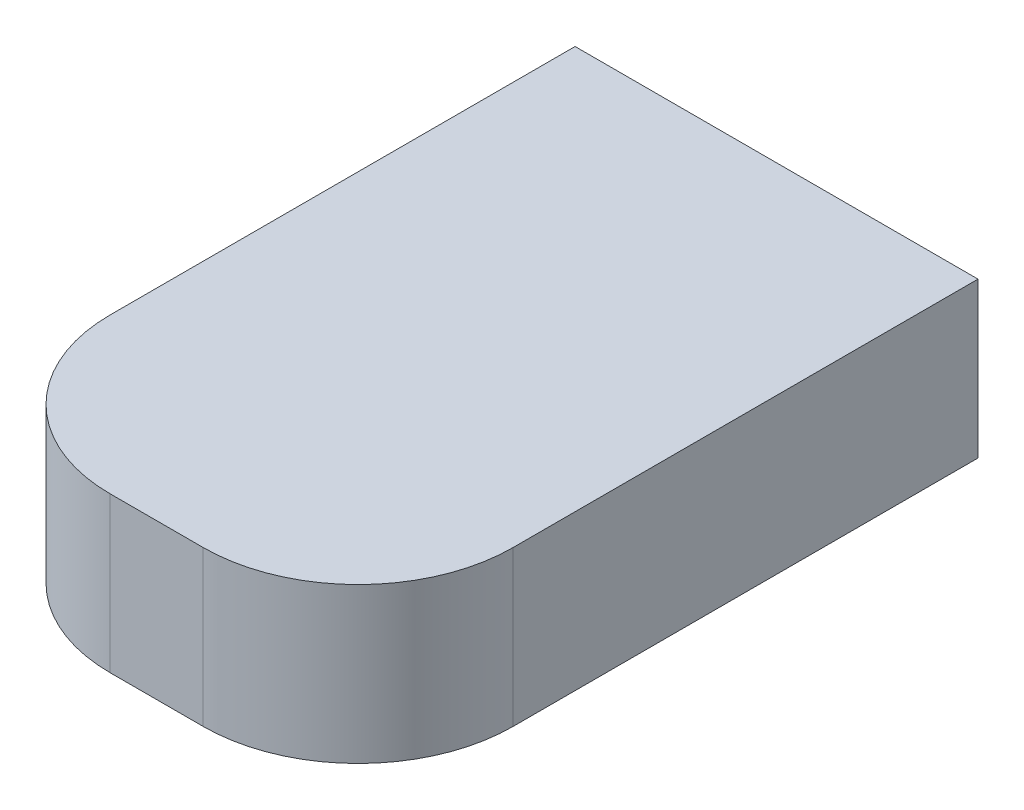
ISO-10303-21;
HEADER;
FILE_DESCRIPTION(('STEP AP214'),'2;1');
FILE_NAME('part.step','',(''),(''),'','','');
FILE_SCHEMA(('AUTOMOTIVE_DESIGN { 1 0 10303 214 1 1 1 1 }'));
ENDSEC;
DATA;
#1=APPLICATION_CONTEXT('core data for automotive mechanical design processes');
#2=APPLICATION_PROTOCOL_DEFINITION('international standard','automotive_design',2000,#1);
#3=PRODUCT_CONTEXT('',#1,'mechanical');
#4=PRODUCT('Part','Part','',(#3));
#5=PRODUCT_RELATED_PRODUCT_CATEGORY('part','',(#4));
#6=PRODUCT_DEFINITION_FORMATION('','',#4);
#7=PRODUCT_DEFINITION_CONTEXT('part definition',#1,'design');
#8=PRODUCT_DEFINITION('design','',#6,#7);
#9=PRODUCT_DEFINITION_SHAPE('','',#8);
#10=(LENGTH_UNIT() NAMED_UNIT(*) SI_UNIT(.MILLI.,.METRE.));
#11=(NAMED_UNIT(*) PLANE_ANGLE_UNIT() SI_UNIT($,.RADIAN.));
#12=(NAMED_UNIT(*) SI_UNIT($,.STERADIAN.) SOLID_ANGLE_UNIT());
#13=UNCERTAINTY_MEASURE_WITH_UNIT(LENGTH_MEASURE(1.E-05),#10,'distance_accuracy_value','');
#14=(GEOMETRIC_REPRESENTATION_CONTEXT(3) GLOBAL_UNCERTAINTY_ASSIGNED_CONTEXT((#13)) GLOBAL_UNIT_ASSIGNED_CONTEXT((#10,
#11,#12)) REPRESENTATION_CONTEXT('',''));
#15=CARTESIAN_POINT('',(0.,0.,0.));
#16=DIRECTION('',(0.,0.,1.));
#17=DIRECTION('',(1.,0.,0.));
#18=AXIS2_PLACEMENT_3D('',#15,#16,#17);
#19=CARTESIAN_POINT('',(1.95,1.5,3.));
#20=DIRECTION('',(-1.,0.,0.));
#21=DIRECTION('',(0.,0.,1.));
#22=AXIS2_PLACEMENT_3D('',#19,#20,#21);
#23=PLANE('',#22);
#24=DIRECTION('',(0.,0.,-1.));
#25=VECTOR('',#24,1.);
#26=CARTESIAN_POINT('',(1.95,1.5,3.));
#27=LINE('',#26,#25);
#28=CARTESIAN_POINT('',(1.95,1.5,1.5));
#29=VERTEX_POINT('',#28);
#30=CARTESIAN_POINT('',(1.95,1.5,-3.));
#31=VERTEX_POINT('',#30);
#32=EDGE_CURVE('E86',#29,#31,#27,.T.);
#33=ORIENTED_EDGE('',*,*,#32,.F.);
#34=DIRECTION('',(0.,-1.,0.));
#35=VECTOR('',#34,1.);
#36=CARTESIAN_POINT('',(1.95,1.5,1.5));
#37=LINE('',#36,#35);
#38=CARTESIAN_POINT('',(1.95,0.,1.5));
#39=VERTEX_POINT('',#38);
#40=EDGE_CURVE('E109',#29,#39,#37,.T.);
#41=ORIENTED_EDGE('',*,*,#40,.T.);
#42=DIRECTION('',(0.,0.,-1.));
#43=VECTOR('',#42,1.);
#44=CARTESIAN_POINT('',(1.95,0.,3.));
#45=LINE('',#44,#43);
#46=CARTESIAN_POINT('',(1.95,0.,-3.));
#47=VERTEX_POINT('',#46);
#48=EDGE_CURVE('E107',#39,#47,#45,.T.);
#49=ORIENTED_EDGE('',*,*,#48,.T.);
#50=DIRECTION('',(0.,-1.,0.));
#51=VECTOR('',#50,1.);
#52=CARTESIAN_POINT('',(1.95,1.5,-3.));
#53=LINE('',#52,#51);
#54=EDGE_CURVE('E101',#31,#47,#53,.T.);
#55=ORIENTED_EDGE('',*,*,#54,.F.);
#56=EDGE_LOOP('',(#33,#41,#49,#55));
#57=FACE_BOUND('',#56,.T.);
#58=ADVANCED_FACE('F32',(#57),#23,.F.);
#59=CARTESIAN_POINT('',(-1.95,1.5,-3.));
#60=DIRECTION('',(0.,0.,1.));
#61=DIRECTION('',(1.,0.,0.));
#62=AXIS2_PLACEMENT_3D('',#59,#60,#61);
#63=PLANE('',#62);
#64=DIRECTION('',(-1.,0.,0.));
#65=VECTOR('',#64,1.);
#66=CARTESIAN_POINT('',(-1.95,0.,-3.));
#67=LINE('',#66,#65);
#68=CARTESIAN_POINT('',(-1.95,0.,-3.));
#69=VERTEX_POINT('',#68);
#70=EDGE_CURVE('E136',#47,#69,#67,.T.);
#71=ORIENTED_EDGE('',*,*,#70,.T.);
#72=DIRECTION('',(0.,-1.,0.));
#73=VECTOR('',#72,1.);
#74=CARTESIAN_POINT('',(-1.95,1.5,-3.));
#75=LINE('',#74,#73);
#76=CARTESIAN_POINT('',(-1.95,1.5,-3.));
#77=VERTEX_POINT('',#76);
#78=EDGE_CURVE('E103',#77,#69,#75,.T.);
#79=ORIENTED_EDGE('',*,*,#78,.F.);
#80=DIRECTION('',(-1.,0.,0.));
#81=VECTOR('',#80,1.);
#82=CARTESIAN_POINT('',(-1.95,1.5,-3.));
#83=LINE('',#82,#81);
#84=EDGE_CURVE('E89',#31,#77,#83,.T.);
#85=ORIENTED_EDGE('',*,*,#84,.F.);
#86=ORIENTED_EDGE('',*,*,#54,.T.);
#87=EDGE_LOOP('',(#71,#79,#85,#86));
#88=FACE_BOUND('',#87,.T.);
#89=ADVANCED_FACE('F100',(#88),#63,.F.);
#90=CARTESIAN_POINT('',(-1.95,1.5,3.));
#91=DIRECTION('',(1.,0.,0.));
#92=DIRECTION('',(0.,0.,-1.));
#93=AXIS2_PLACEMENT_3D('',#90,#91,#92);
#94=PLANE('',#93);
#95=DIRECTION('',(0.,0.,1.));
#96=VECTOR('',#95,1.);
#97=CARTESIAN_POINT('',(-1.95,0.,3.));
#98=LINE('',#97,#96);
#99=CARTESIAN_POINT('',(-1.95,0.,1.5));
#100=VERTEX_POINT('',#99);
#101=EDGE_CURVE('E134',#69,#100,#98,.T.);
#102=ORIENTED_EDGE('',*,*,#101,.T.);
#103=DIRECTION('',(0.,-1.,0.));
#104=VECTOR('',#103,1.);
#105=CARTESIAN_POINT('',(-1.95,1.5,1.5));
#106=LINE('',#105,#104);
#107=CARTESIAN_POINT('',(-1.95,1.5,1.5));
#108=VERTEX_POINT('',#107);
#109=EDGE_CURVE('E11',#100,#108,#106,.F.);
#110=ORIENTED_EDGE('',*,*,#109,.T.);
#111=DIRECTION('',(0.,0.,1.));
#112=VECTOR('',#111,1.);
#113=CARTESIAN_POINT('',(-1.95,1.5,3.));
#114=LINE('',#113,#112);
#115=EDGE_CURVE('E104',#77,#108,#114,.T.);
#116=ORIENTED_EDGE('',*,*,#115,.F.);
#117=ORIENTED_EDGE('',*,*,#78,.T.);
#118=EDGE_LOOP('',(#102,#110,#116,#117));
#119=FACE_BOUND('',#118,.T.);
#120=ADVANCED_FACE('F135',(#119),#94,.F.);
#121=CARTESIAN_POINT('',(-1.95,1.5,3.));
#122=DIRECTION('',(0.,0.,-1.));
#123=DIRECTION('',(-1.,0.,0.));
#124=AXIS2_PLACEMENT_3D('',#121,#122,#123);
#125=PLANE('',#124);
#126=DIRECTION('',(1.,0.,0.));
#127=VECTOR('',#126,1.);
#128=CARTESIAN_POINT('',(-1.95,0.,3.));
#129=LINE('',#128,#127);
#130=CARTESIAN_POINT('',(-0.45,0.,3.));
#131=VERTEX_POINT('',#130);
#132=CARTESIAN_POINT('',(0.45,0.,3.));
#133=VERTEX_POINT('',#132);
#134=EDGE_CURVE('E96',#131,#133,#129,.T.);
#135=ORIENTED_EDGE('',*,*,#134,.T.);
#136=DIRECTION('',(0.,-1.,0.));
#137=VECTOR('',#136,1.);
#138=CARTESIAN_POINT('',(0.45,1.5,3.));
#139=LINE('',#138,#137);
#140=CARTESIAN_POINT('',(0.45,1.5,3.));
#141=VERTEX_POINT('',#140);
#142=EDGE_CURVE('E53',#133,#141,#139,.F.);
#143=ORIENTED_EDGE('',*,*,#142,.T.);
#144=DIRECTION('',(1.,0.,0.));
#145=VECTOR('',#144,1.);
#146=CARTESIAN_POINT('',(-1.95,1.5,3.));
#147=LINE('',#146,#145);
#148=CARTESIAN_POINT('',(-0.45,1.5,3.));
#149=VERTEX_POINT('',#148);
#150=EDGE_CURVE('E113',#149,#141,#147,.T.);
#151=ORIENTED_EDGE('',*,*,#150,.F.);
#152=DIRECTION('',(0.,-1.,0.));
#153=VECTOR('',#152,1.);
#154=CARTESIAN_POINT('',(-0.45,1.5,3.));
#155=LINE('',#154,#153);
#156=EDGE_CURVE('E120',#149,#131,#155,.T.);
#157=ORIENTED_EDGE('',*,*,#156,.T.);
#158=EDGE_LOOP('',(#135,#143,#151,#157));
#159=FACE_BOUND('',#158,.T.);
#160=ADVANCED_FACE('F128',(#159),#125,.F.);
#161=CARTESIAN_POINT('',(0.,1.5,0.));
#162=DIRECTION('',(0.,-1.,0.));
#163=DIRECTION('',(0.,0.,-1.));
#164=AXIS2_PLACEMENT_3D('',#161,#162,#163);
#165=PLANE('',#164);
#166=ORIENTED_EDGE('',*,*,#150,.T.);
#167=CARTESIAN_POINT('',(0.45,1.5,1.5));
#168=DIRECTION('',(0.,-1.,0.));
#169=DIRECTION('',(0.,0.,-1.));
#170=AXIS2_PLACEMENT_3D('',#167,#168,#169);
#171=CIRCLE('',#170,1.5);
#172=EDGE_CURVE('E40',#141,#29,#171,.F.);
#173=ORIENTED_EDGE('',*,*,#172,.T.);
#174=ORIENTED_EDGE('',*,*,#32,.T.);
#175=ORIENTED_EDGE('',*,*,#84,.T.);
#176=ORIENTED_EDGE('',*,*,#115,.T.);
#177=CARTESIAN_POINT('',(-0.45,1.5,1.5));
#178=DIRECTION('',(0.,-1.,0.));
#179=DIRECTION('',(0.,0.,-1.));
#180=AXIS2_PLACEMENT_3D('',#177,#178,#179);
#181=CIRCLE('',#180,1.5);
#182=EDGE_CURVE('E124',#108,#149,#181,.F.);
#183=ORIENTED_EDGE('',*,*,#182,.T.);
#184=EDGE_LOOP('',(#166,#173,#174,#175,#176,#183));
#185=FACE_BOUND('',#184,.T.);
#186=ADVANCED_FACE('F88',(#185),#165,.F.);
#187=CARTESIAN_POINT('',(0.,0.,0.));
#188=DIRECTION('',(0.,-1.,0.));
#189=DIRECTION('',(0.,0.,-1.));
#190=AXIS2_PLACEMENT_3D('',#187,#188,#189);
#191=PLANE('',#190);
#192=ORIENTED_EDGE('',*,*,#48,.F.);
#193=CARTESIAN_POINT('',(0.45,0.,1.5));
#194=DIRECTION('',(0.,-1.,0.));
#195=DIRECTION('',(0.,0.,-1.));
#196=AXIS2_PLACEMENT_3D('',#193,#194,#195);
#197=CIRCLE('',#196,1.5);
#198=EDGE_CURVE('E118',#39,#133,#197,.T.);
#199=ORIENTED_EDGE('',*,*,#198,.T.);
#200=ORIENTED_EDGE('',*,*,#134,.F.);
#201=CARTESIAN_POINT('',(-0.45,0.,1.5));
#202=DIRECTION('',(0.,-1.,0.));
#203=DIRECTION('',(0.,0.,-1.));
#204=AXIS2_PLACEMENT_3D('',#201,#202,#203);
#205=CIRCLE('',#204,1.5);
#206=EDGE_CURVE('E111',#131,#100,#205,.T.);
#207=ORIENTED_EDGE('',*,*,#206,.T.);
#208=ORIENTED_EDGE('',*,*,#101,.F.);
#209=ORIENTED_EDGE('',*,*,#70,.F.);
#210=EDGE_LOOP('',(#192,#199,#200,#207,#208,#209));
#211=FACE_BOUND('',#210,.T.);
#212=ADVANCED_FACE('F133',(#211),#191,.T.);
#213=CARTESIAN_POINT('',(0.45,1.5,1.5));
#214=DIRECTION('',(0.,-1.,0.));
#215=DIRECTION('',(0.,0.,-1.));
#216=AXIS2_PLACEMENT_3D('',#213,#214,#215);
#217=CYLINDRICAL_SURFACE('',#216,1.5);
#218=ORIENTED_EDGE('',*,*,#172,.F.);
#219=ORIENTED_EDGE('',*,*,#142,.F.);
#220=ORIENTED_EDGE('',*,*,#198,.F.);
#221=ORIENTED_EDGE('',*,*,#40,.F.);
#222=EDGE_LOOP('',(#218,#219,#220,#221));
#223=FACE_BOUND('',#222,.T.);
#224=ADVANCED_FACE('F142',(#223),#217,.T.);
#225=CARTESIAN_POINT('',(-0.45,1.5,1.5));
#226=DIRECTION('',(0.,-1.,0.));
#227=DIRECTION('',(0.,0.,-1.));
#228=AXIS2_PLACEMENT_3D('',#225,#226,#227);
#229=CYLINDRICAL_SURFACE('',#228,1.5);
#230=ORIENTED_EDGE('',*,*,#182,.F.);
#231=ORIENTED_EDGE('',*,*,#109,.F.);
#232=ORIENTED_EDGE('',*,*,#206,.F.);
#233=ORIENTED_EDGE('',*,*,#156,.F.);
#234=EDGE_LOOP('',(#230,#231,#232,#233));
#235=FACE_BOUND('',#234,.T.);
#236=ADVANCED_FACE('F34',(#235),#229,.T.);
#237=CLOSED_SHELL('',(#58,#89,#120,#160,#186,#212,#224,#236));
#238=MANIFOLD_SOLID_BREP('B2',#237);
#239=ADVANCED_BREP_SHAPE_REPRESENTATION('',(#18,#238),#14);
#240=SHAPE_DEFINITION_REPRESENTATION(#9,#239);
ENDSEC;
END-ISO-10303-21;
